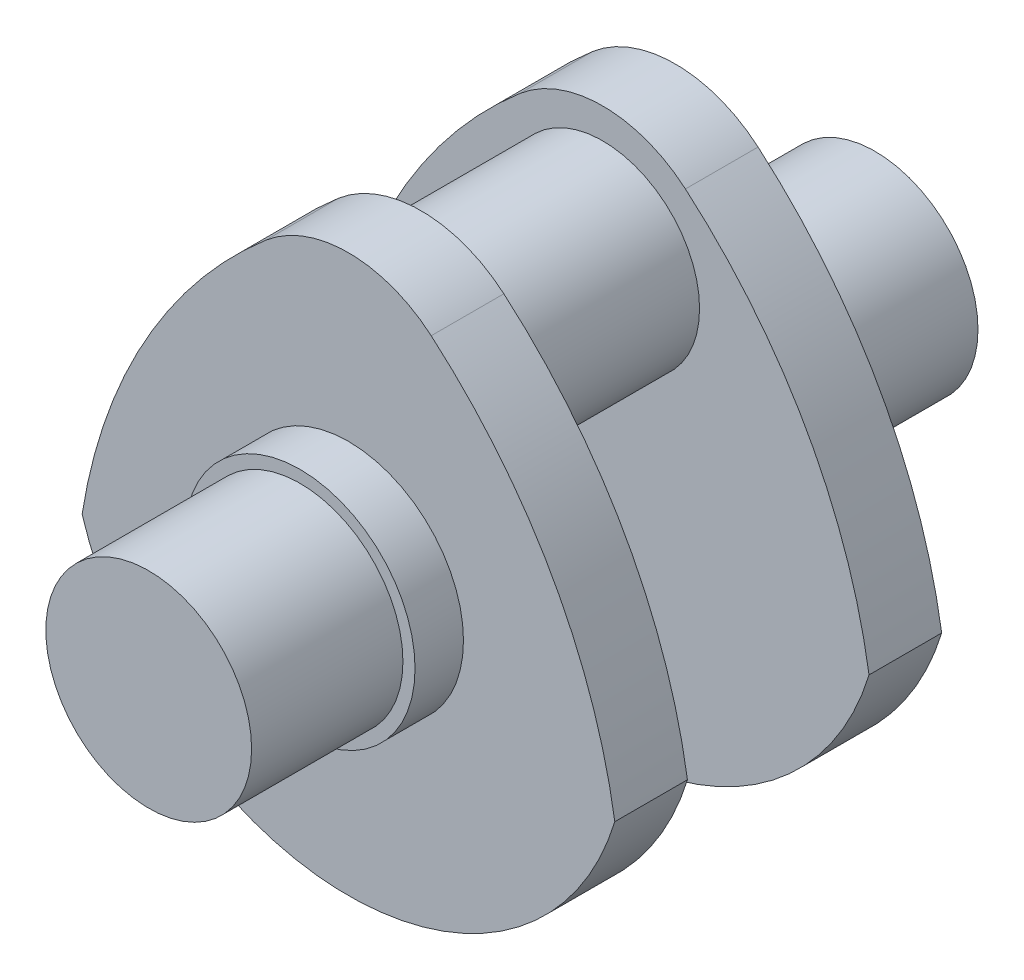
ISO-10303-21;
HEADER;
FILE_DESCRIPTION(('STEP AP214'),'2;1');
FILE_NAME('part.step','',(''),(''),'','','');
FILE_SCHEMA(('AUTOMOTIVE_DESIGN { 1 0 10303 214 1 1 1 1 }'));
ENDSEC;
DATA;
#1=APPLICATION_CONTEXT('core data for automotive mechanical design processes');
#2=APPLICATION_PROTOCOL_DEFINITION('international standard','automotive_design',2000,#1);
#3=PRODUCT_CONTEXT('',#1,'mechanical');
#4=PRODUCT('Part','Part','',(#3));
#5=PRODUCT_RELATED_PRODUCT_CATEGORY('part','',(#4));
#6=PRODUCT_DEFINITION_FORMATION('','',#4);
#7=PRODUCT_DEFINITION_CONTEXT('part definition',#1,'design');
#8=PRODUCT_DEFINITION('design','',#6,#7);
#9=PRODUCT_DEFINITION_SHAPE('','',#8);
#10=(LENGTH_UNIT() NAMED_UNIT(*) SI_UNIT(.MILLI.,.METRE.));
#11=(NAMED_UNIT(*) PLANE_ANGLE_UNIT() SI_UNIT($,.RADIAN.));
#12=(NAMED_UNIT(*) SI_UNIT($,.STERADIAN.) SOLID_ANGLE_UNIT());
#13=UNCERTAINTY_MEASURE_WITH_UNIT(LENGTH_MEASURE(1.E-05),#10,'distance_accuracy_value','');
#14=(GEOMETRIC_REPRESENTATION_CONTEXT(3) GLOBAL_UNCERTAINTY_ASSIGNED_CONTEXT((#13)) GLOBAL_UNIT_ASSIGNED_CONTEXT((#10,
#11,#12)) REPRESENTATION_CONTEXT('',''));
#15=CARTESIAN_POINT('',(0.,0.,0.));
#16=DIRECTION('',(0.,0.,1.));
#17=DIRECTION('',(1.,0.,0.));
#18=AXIS2_PLACEMENT_3D('',#15,#16,#17);
#19=CARTESIAN_POINT('',(0.,0.,25.));
#20=DIRECTION('',(0.,0.,-1.));
#21=DIRECTION('',(-1.,0.,0.));
#22=AXIS2_PLACEMENT_3D('',#19,#20,#21);
#23=CYLINDRICAL_SURFACE('',#22,17.);
#24=CARTESIAN_POINT('',(0.,0.,25.));
#25=DIRECTION('',(0.,0.,1.));
#26=DIRECTION('',(1.,0.,0.));
#27=AXIS2_PLACEMENT_3D('',#24,#25,#26);
#28=CIRCLE('',#27,17.);
#29=CARTESIAN_POINT('',(17.,0.,25.));
#30=VERTEX_POINT('',#29);
#31=EDGE_CURVE('E41',#30,#30,#28,.T.);
#32=ORIENTED_EDGE('',*,*,#31,.F.);
#33=EDGE_LOOP('',(#32));
#34=FACE_BOUND('',#33,.T.);
#35=CARTESIAN_POINT('',(0.,0.,0.));
#36=DIRECTION('',(0.,0.,1.));
#37=DIRECTION('',(1.,0.,0.));
#38=AXIS2_PLACEMENT_3D('',#35,#36,#37);
#39=CIRCLE('',#38,17.);
#40=CARTESIAN_POINT('',(17.,0.,0.));
#41=VERTEX_POINT('',#40);
#42=EDGE_CURVE('E193',#41,#41,#39,.T.);
#43=ORIENTED_EDGE('',*,*,#42,.T.);
#44=EDGE_LOOP('',(#43));
#45=FACE_BOUND('',#44,.T.);
#46=ADVANCED_FACE('F33',(#34,#45),#23,.T.);
#47=CARTESIAN_POINT('',(0.,0.,25.));
#48=DIRECTION('',(0.,0.,1.));
#49=DIRECTION('',(1.,0.,0.));
#50=AXIS2_PLACEMENT_3D('',#47,#48,#49);
#51=PLANE('',#50);
#52=ORIENTED_EDGE('',*,*,#31,.T.);
#53=EDGE_LOOP('',(#52));
#54=FACE_BOUND('',#53,.T.);
#55=ADVANCED_FACE('F208',(#54),#51,.T.);
#56=CARTESIAN_POINT('',(0.,0.,-8.));
#57=DIRECTION('',(0.,0.,1.));
#58=DIRECTION('',(1.,0.,0.));
#59=AXIS2_PLACEMENT_3D('',#56,#57,#58);
#60=CYLINDRICAL_SURFACE('',#59,19.);
#61=CARTESIAN_POINT('',(0.,0.,-8.));
#62=DIRECTION('',(0.,0.,1.));
#63=DIRECTION('',(1.,0.,0.));
#64=AXIS2_PLACEMENT_3D('',#61,#62,#63);
#65=CIRCLE('',#64,19.);
#66=CARTESIAN_POINT('',(19.,0.,-8.));
#67=VERTEX_POINT('',#66);
#68=EDGE_CURVE('E187',#67,#67,#65,.T.);
#69=ORIENTED_EDGE('',*,*,#68,.T.);
#70=EDGE_LOOP('',(#69));
#71=FACE_BOUND('',#70,.T.);
#72=CARTESIAN_POINT('',(0.,0.,0.));
#73=DIRECTION('',(0.,0.,1.));
#74=DIRECTION('',(1.,0.,0.));
#75=AXIS2_PLACEMENT_3D('',#72,#73,#74);
#76=CIRCLE('',#75,19.);
#77=CARTESIAN_POINT('',(19.,0.,0.));
#78=VERTEX_POINT('',#77);
#79=EDGE_CURVE('E190',#78,#78,#76,.T.);
#80=ORIENTED_EDGE('',*,*,#79,.F.);
#81=EDGE_LOOP('',(#80));
#82=FACE_BOUND('',#81,.T.);
#83=ADVANCED_FACE('F203',(#71,#82),#60,.T.);
#84=CARTESIAN_POINT('',(0.,0.,0.));
#85=DIRECTION('',(0.,0.,1.));
#86=DIRECTION('',(1.,0.,0.));
#87=AXIS2_PLACEMENT_3D('',#84,#85,#86);
#88=PLANE('',#87);
#89=ORIENTED_EDGE('',*,*,#42,.F.);
#90=EDGE_LOOP('',(#89));
#91=FACE_BOUND('',#90,.T.);
#92=ORIENTED_EDGE('',*,*,#79,.T.);
#93=EDGE_LOOP('',(#92));
#94=FACE_BOUND('',#93,.T.);
#95=ADVANCED_FACE('F199',(#91,#94),#88,.T.);
#96=CARTESIAN_POINT('',(44.9094542035734,-27.3845485151599,-20.));
#97=DIRECTION('',(0.,0.,1.));
#98=DIRECTION('',(1.,0.,0.));
#99=AXIS2_PLACEMENT_3D('',#96,#97,#98);
#100=CYLINDRICAL_SURFACE('',#99,90.);
#101=CARTESIAN_POINT('',(44.9094542035734,-27.3845485151599,-8.));
#102=DIRECTION('',(0.,0.,-1.));
#103=DIRECTION('',(1.,0.,0.));
#104=AXIS2_PLACEMENT_3D('',#101,#102,#103);
#105=CIRCLE('',#104,90.);
#106=CARTESIAN_POINT('',(-44.,-13.4164078649987,-8.));
#107=VERTEX_POINT('',#106);
#108=CARTESIAN_POINT('',(-13.6680947576093,40.9431234611356,-8.));
#109=VERTEX_POINT('',#108);
#110=EDGE_CURVE('E166',#107,#109,#105,.T.);
#111=ORIENTED_EDGE('',*,*,#110,.T.);
#112=DIRECTION('',(0.,0.,1.));
#113=VECTOR('',#112,1.);
#114=CARTESIAN_POINT('',(-13.6680947576093,40.9431234611356,-20.));
#115=LINE('',#114,#113);
#116=CARTESIAN_POINT('',(-13.6680947576093,40.9431234611356,-20.));
#117=VERTEX_POINT('',#116);
#118=EDGE_CURVE('E185',#117,#109,#115,.T.);
#119=ORIENTED_EDGE('',*,*,#118,.F.);
#120=CARTESIAN_POINT('',(44.9094542035734,-27.3845485151599,-20.));
#121=DIRECTION('',(0.,0.,-1.));
#122=DIRECTION('',(1.,0.,0.));
#123=AXIS2_PLACEMENT_3D('',#120,#121,#122);
#124=CIRCLE('',#123,90.);
#125=CARTESIAN_POINT('',(-44.,-13.4164078649987,-20.));
#126=VERTEX_POINT('',#125);
#127=EDGE_CURVE('E167',#126,#117,#124,.T.);
#128=ORIENTED_EDGE('',*,*,#127,.F.);
#129=DIRECTION('',(0.,0.,1.));
#130=VECTOR('',#129,1.);
#131=CARTESIAN_POINT('',(-44.,-13.4164078649987,-20.));
#132=LINE('',#131,#130);
#133=EDGE_CURVE('E173',#126,#107,#132,.T.);
#134=ORIENTED_EDGE('',*,*,#133,.T.);
#135=EDGE_LOOP('',(#111,#119,#128,#134));
#136=FACE_BOUND('',#135,.T.);
#137=ADVANCED_FACE('F202',(#136),#100,.T.);
#138=CARTESIAN_POINT('',(0.,25.,-20.));
#139=DIRECTION('',(0.,0.,1.));
#140=DIRECTION('',(1.,0.,0.));
#141=AXIS2_PLACEMENT_3D('',#138,#139,#140);
#142=CYLINDRICAL_SURFACE('',#141,21.);
#143=CARTESIAN_POINT('',(0.,25.,-8.));
#144=DIRECTION('',(0.,0.,-1.));
#145=DIRECTION('',(-1.,0.,0.));
#146=AXIS2_PLACEMENT_3D('',#143,#144,#145);
#147=CIRCLE('',#146,21.);
#148=CARTESIAN_POINT('',(13.6680947576093,40.9431234611356,-8.));
#149=VERTEX_POINT('',#148);
#150=EDGE_CURVE('E176',#109,#149,#147,.T.);
#151=ORIENTED_EDGE('',*,*,#150,.T.);
#152=DIRECTION('',(0.,0.,1.));
#153=VECTOR('',#152,1.);
#154=CARTESIAN_POINT('',(13.6680947576093,40.9431234611356,-20.));
#155=LINE('',#154,#153);
#156=CARTESIAN_POINT('',(13.6680947576093,40.9431234611356,-20.));
#157=VERTEX_POINT('',#156);
#158=EDGE_CURVE('E183',#157,#149,#155,.T.);
#159=ORIENTED_EDGE('',*,*,#158,.F.);
#160=CARTESIAN_POINT('',(0.,25.,-20.));
#161=DIRECTION('',(0.,0.,-1.));
#162=DIRECTION('',(-1.,0.,0.));
#163=AXIS2_PLACEMENT_3D('',#160,#161,#162);
#164=CIRCLE('',#163,21.);
#165=EDGE_CURVE('E81',#117,#157,#164,.T.);
#166=ORIENTED_EDGE('',*,*,#165,.F.);
#167=ORIENTED_EDGE('',*,*,#118,.T.);
#168=EDGE_LOOP('',(#151,#159,#166,#167));
#169=FACE_BOUND('',#168,.T.);
#170=ADVANCED_FACE('F243',(#169),#142,.T.);
#171=CARTESIAN_POINT('',(-44.9094542035734,-27.3845485151599,-20.));
#172=DIRECTION('',(0.,0.,1.));
#173=DIRECTION('',(1.,0.,0.));
#174=AXIS2_PLACEMENT_3D('',#171,#172,#173);
#175=CYLINDRICAL_SURFACE('',#174,90.);
#176=CARTESIAN_POINT('',(-44.9094542035734,-27.3845485151599,-8.));
#177=DIRECTION('',(0.,0.,-1.));
#178=DIRECTION('',(-1.,0.,0.));
#179=AXIS2_PLACEMENT_3D('',#176,#177,#178);
#180=CIRCLE('',#179,90.);
#181=CARTESIAN_POINT('',(44.,-13.4164078649987,-8.));
#182=VERTEX_POINT('',#181);
#183=EDGE_CURVE('E67',#149,#182,#180,.T.);
#184=ORIENTED_EDGE('',*,*,#183,.T.);
#185=DIRECTION('',(0.,0.,1.));
#186=VECTOR('',#185,1.);
#187=CARTESIAN_POINT('',(44.,-13.4164078649987,-20.));
#188=LINE('',#187,#186);
#189=CARTESIAN_POINT('',(44.,-13.4164078649987,-20.));
#190=VERTEX_POINT('',#189);
#191=EDGE_CURVE('E181',#190,#182,#188,.T.);
#192=ORIENTED_EDGE('',*,*,#191,.F.);
#193=CARTESIAN_POINT('',(-44.9094542035734,-27.3845485151599,-20.));
#194=DIRECTION('',(0.,0.,-1.));
#195=DIRECTION('',(-1.,0.,0.));
#196=AXIS2_PLACEMENT_3D('',#193,#194,#195);
#197=CIRCLE('',#196,90.);
#198=EDGE_CURVE('E170',#157,#190,#197,.T.);
#199=ORIENTED_EDGE('',*,*,#198,.F.);
#200=ORIENTED_EDGE('',*,*,#158,.T.);
#201=EDGE_LOOP('',(#184,#192,#199,#200));
#202=FACE_BOUND('',#201,.T.);
#203=ADVANCED_FACE('F252',(#202),#175,.T.);
#204=CARTESIAN_POINT('',(0.,0.,-20.));
#205=DIRECTION('',(0.,0.,1.));
#206=DIRECTION('',(1.,0.,0.));
#207=AXIS2_PLACEMENT_3D('',#204,#205,#206);
#208=CYLINDRICAL_SURFACE('',#207,46.);
#209=CARTESIAN_POINT('',(0.,0.,-8.));
#210=DIRECTION('',(0.,0.,-1.));
#211=DIRECTION('',(1.,0.,0.));
#212=AXIS2_PLACEMENT_3D('',#209,#210,#211);
#213=CIRCLE('',#212,46.);
#214=EDGE_CURVE('E73',#182,#107,#213,.T.);
#215=ORIENTED_EDGE('',*,*,#214,.T.);
#216=ORIENTED_EDGE('',*,*,#133,.F.);
#217=CARTESIAN_POINT('',(0.,0.,-20.));
#218=DIRECTION('',(0.,0.,-1.));
#219=DIRECTION('',(1.,0.,0.));
#220=AXIS2_PLACEMENT_3D('',#217,#218,#219);
#221=CIRCLE('',#220,46.);
#222=EDGE_CURVE('E49',#190,#126,#221,.T.);
#223=ORIENTED_EDGE('',*,*,#222,.F.);
#224=ORIENTED_EDGE('',*,*,#191,.T.);
#225=EDGE_LOOP('',(#215,#216,#223,#224));
#226=FACE_BOUND('',#225,.T.);
#227=ADVANCED_FACE('F260',(#226),#208,.T.);
#228=CARTESIAN_POINT('',(22.4547271017867,-13.69227425758,-20.));
#229=DIRECTION('',(0.,0.,1.));
#230=DIRECTION('',(1.,0.,0.));
#231=AXIS2_PLACEMENT_3D('',#228,#229,#230);
#232=PLANE('',#231);
#233=CARTESIAN_POINT('',(0.,25.,-20.));
#234=DIRECTION('',(0.,0.,1.));
#235=DIRECTION('',(1.,0.,0.));
#236=AXIS2_PLACEMENT_3D('',#233,#234,#235);
#237=CIRCLE('',#236,16.);
#238=CARTESIAN_POINT('',(16.,25.,-20.));
#239=VERTEX_POINT('',#238);
#240=EDGE_CURVE('E11',#239,#239,#237,.F.);
#241=ORIENTED_EDGE('',*,*,#240,.F.);
#242=EDGE_LOOP('',(#241));
#243=FACE_BOUND('',#242,.T.);
#244=ORIENTED_EDGE('',*,*,#127,.T.);
#245=ORIENTED_EDGE('',*,*,#165,.T.);
#246=ORIENTED_EDGE('',*,*,#198,.T.);
#247=ORIENTED_EDGE('',*,*,#222,.T.);
#248=EDGE_LOOP('',(#244,#245,#246,#247));
#249=FACE_BOUND('',#248,.T.);
#250=ADVANCED_FACE('F268',(#243,#249),#232,.F.);
#251=CARTESIAN_POINT('',(22.4547271017867,-13.69227425758,-8.));
#252=DIRECTION('',(0.,0.,1.));
#253=DIRECTION('',(1.,0.,0.));
#254=AXIS2_PLACEMENT_3D('',#251,#252,#253);
#255=PLANE('',#254);
#256=ORIENTED_EDGE('',*,*,#68,.F.);
#257=EDGE_LOOP('',(#256));
#258=FACE_BOUND('',#257,.T.);
#259=ORIENTED_EDGE('',*,*,#110,.F.);
#260=ORIENTED_EDGE('',*,*,#214,.F.);
#261=ORIENTED_EDGE('',*,*,#183,.F.);
#262=ORIENTED_EDGE('',*,*,#150,.F.);
#263=EDGE_LOOP('',(#259,#260,#261,#262));
#264=FACE_BOUND('',#263,.T.);
#265=ADVANCED_FACE('F277',(#258,#264),#255,.T.);
#266=CARTESIAN_POINT('',(0.,25.,-35.));
#267=DIRECTION('',(0.,0.,1.));
#268=DIRECTION('',(1.,0.,0.));
#269=AXIS2_PLACEMENT_3D('',#266,#267,#268);
#270=CYLINDRICAL_SURFACE('',#269,16.);
#271=ORIENTED_EDGE('',*,*,#240,.T.);
#272=EDGE_LOOP('',(#271));
#273=FACE_BOUND('',#272,.T.);
#274=CARTESIAN_POINT('',(0.,25.,-50.));
#275=DIRECTION('',(0.,0.,1.));
#276=DIRECTION('',(1.,0.,0.));
#277=AXIS2_PLACEMENT_3D('',#274,#275,#276);
#278=CIRCLE('',#277,16.);
#279=CARTESIAN_POINT('',(16.,25.,-50.));
#280=VERTEX_POINT('',#279);
#281=EDGE_CURVE('E161',#280,#280,#278,.F.);
#282=ORIENTED_EDGE('',*,*,#281,.F.);
#283=EDGE_LOOP('',(#282));
#284=FACE_BOUND('',#283,.T.);
#285=ADVANCED_FACE('F286',(#273,#284),#270,.T.);
#286=CARTESIAN_POINT('',(0.,0.,-95.));
#287=DIRECTION('',(0.,0.,1.));
#288=DIRECTION('',(-1.,0.,0.));
#289=AXIS2_PLACEMENT_3D('',#286,#287,#288);
#290=CYLINDRICAL_SURFACE('',#289,17.);
#291=CARTESIAN_POINT('',(0.,0.,-95.));
#292=DIRECTION('',(0.,0.,1.));
#293=DIRECTION('',(1.,0.,0.));
#294=AXIS2_PLACEMENT_3D('',#291,#292,#293);
#295=CIRCLE('',#294,17.);
#296=CARTESIAN_POINT('',(17.,0.,-95.));
#297=VERTEX_POINT('',#296);
#298=EDGE_CURVE('E158',#297,#297,#295,.T.);
#299=ORIENTED_EDGE('',*,*,#298,.T.);
#300=EDGE_LOOP('',(#299));
#301=FACE_BOUND('',#300,.T.);
#302=CARTESIAN_POINT('',(0.,0.,-70.));
#303=DIRECTION('',(0.,0.,1.));
#304=DIRECTION('',(1.,0.,0.));
#305=AXIS2_PLACEMENT_3D('',#302,#303,#304);
#306=CIRCLE('',#305,17.);
#307=CARTESIAN_POINT('',(17.,0.,-70.));
#308=VERTEX_POINT('',#307);
#309=EDGE_CURVE('E157',#308,#308,#306,.T.);
#310=ORIENTED_EDGE('',*,*,#309,.F.);
#311=EDGE_LOOP('',(#310));
#312=FACE_BOUND('',#311,.T.);
#313=ADVANCED_FACE('F295',(#301,#312),#290,.T.);
#314=CARTESIAN_POINT('',(0.,0.,-95.));
#315=DIRECTION('',(0.,0.,-1.));
#316=DIRECTION('',(1.,0.,0.));
#317=AXIS2_PLACEMENT_3D('',#314,#315,#316);
#318=PLANE('',#317);
#319=ORIENTED_EDGE('',*,*,#298,.F.);
#320=EDGE_LOOP('',(#319));
#321=FACE_BOUND('',#320,.T.);
#322=ADVANCED_FACE('F303',(#321),#318,.T.);
#323=CARTESIAN_POINT('',(0.,0.,-62.));
#324=DIRECTION('',(0.,0.,-1.));
#325=DIRECTION('',(1.,0.,0.));
#326=AXIS2_PLACEMENT_3D('',#323,#324,#325);
#327=CYLINDRICAL_SURFACE('',#326,19.);
#328=CARTESIAN_POINT('',(0.,0.,-62.));
#329=DIRECTION('',(0.,0.,1.));
#330=DIRECTION('',(1.,0.,0.));
#331=AXIS2_PLACEMENT_3D('',#328,#329,#330);
#332=CIRCLE('',#331,19.);
#333=CARTESIAN_POINT('',(19.,0.,-62.));
#334=VERTEX_POINT('',#333);
#335=EDGE_CURVE('E128',#334,#334,#332,.T.);
#336=ORIENTED_EDGE('',*,*,#335,.F.);
#337=EDGE_LOOP('',(#336));
#338=FACE_BOUND('',#337,.T.);
#339=CARTESIAN_POINT('',(0.,0.,-70.));
#340=DIRECTION('',(0.,0.,1.));
#341=DIRECTION('',(1.,0.,0.));
#342=AXIS2_PLACEMENT_3D('',#339,#340,#341);
#343=CIRCLE('',#342,19.);
#344=CARTESIAN_POINT('',(19.,0.,-70.));
#345=VERTEX_POINT('',#344);
#346=EDGE_CURVE('E154',#345,#345,#343,.T.);
#347=ORIENTED_EDGE('',*,*,#346,.T.);
#348=EDGE_LOOP('',(#347));
#349=FACE_BOUND('',#348,.T.);
#350=ADVANCED_FACE('F311',(#338,#349),#327,.T.);
#351=CARTESIAN_POINT('',(0.,0.,-70.));
#352=DIRECTION('',(0.,0.,-1.));
#353=DIRECTION('',(1.,0.,0.));
#354=AXIS2_PLACEMENT_3D('',#351,#352,#353);
#355=PLANE('',#354);
#356=ORIENTED_EDGE('',*,*,#309,.T.);
#357=EDGE_LOOP('',(#356));
#358=FACE_BOUND('',#357,.T.);
#359=ORIENTED_EDGE('',*,*,#346,.F.);
#360=EDGE_LOOP('',(#359));
#361=FACE_BOUND('',#360,.T.);
#362=ADVANCED_FACE('F319',(#358,#361),#355,.T.);
#363=CARTESIAN_POINT('',(44.9094542035734,-27.3845485151599,-50.));
#364=DIRECTION('',(0.,0.,-1.));
#365=DIRECTION('',(1.,0.,0.));
#366=AXIS2_PLACEMENT_3D('',#363,#364,#365);
#367=CYLINDRICAL_SURFACE('',#366,90.);
#368=CARTESIAN_POINT('',(44.9094542035734,-27.3845485151599,-62.));
#369=DIRECTION('',(0.,0.,-1.));
#370=DIRECTION('',(1.,0.,0.));
#371=AXIS2_PLACEMENT_3D('',#368,#369,#370);
#372=CIRCLE('',#371,90.);
#373=CARTESIAN_POINT('',(-44.,-13.4164078649987,-62.));
#374=VERTEX_POINT('',#373);
#375=CARTESIAN_POINT('',(-13.6680947576093,40.9431234611356,-62.));
#376=VERTEX_POINT('',#375);
#377=EDGE_CURVE('E142',#374,#376,#372,.T.);
#378=ORIENTED_EDGE('',*,*,#377,.F.);
#379=DIRECTION('',(0.,0.,-1.));
#380=VECTOR('',#379,1.);
#381=CARTESIAN_POINT('',(-44.,-13.4164078649987,-50.));
#382=LINE('',#381,#380);
#383=CARTESIAN_POINT('',(-44.,-13.4164078649987,-50.));
#384=VERTEX_POINT('',#383);
#385=EDGE_CURVE('E133',#384,#374,#382,.T.);
#386=ORIENTED_EDGE('',*,*,#385,.F.);
#387=CARTESIAN_POINT('',(44.9094542035734,-27.3845485151599,-50.));
#388=DIRECTION('',(0.,0.,-1.));
#389=DIRECTION('',(1.,0.,0.));
#390=AXIS2_PLACEMENT_3D('',#387,#388,#389);
#391=CIRCLE('',#390,90.);
#392=CARTESIAN_POINT('',(-13.6680947576093,40.9431234611356,-50.));
#393=VERTEX_POINT('',#392);
#394=EDGE_CURVE('E112',#384,#393,#391,.T.);
#395=ORIENTED_EDGE('',*,*,#394,.T.);
#396=DIRECTION('',(0.,0.,-1.));
#397=VECTOR('',#396,1.);
#398=CARTESIAN_POINT('',(-13.6680947576093,40.9431234611356,-50.));
#399=LINE('',#398,#397);
#400=EDGE_CURVE('E121',#393,#376,#399,.T.);
#401=ORIENTED_EDGE('',*,*,#400,.T.);
#402=EDGE_LOOP('',(#378,#386,#395,#401));
#403=FACE_BOUND('',#402,.T.);
#404=ADVANCED_FACE('F131',(#403),#367,.T.);
#405=CARTESIAN_POINT('',(0.,25.,-50.));
#406=DIRECTION('',(0.,0.,-1.));
#407=DIRECTION('',(1.,0.,0.));
#408=AXIS2_PLACEMENT_3D('',#405,#406,#407);
#409=CYLINDRICAL_SURFACE('',#408,21.);
#410=CARTESIAN_POINT('',(0.,25.,-62.));
#411=DIRECTION('',(0.,0.,-1.));
#412=DIRECTION('',(-1.,0.,0.));
#413=AXIS2_PLACEMENT_3D('',#410,#411,#412);
#414=CIRCLE('',#413,21.);
#415=CARTESIAN_POINT('',(13.6680947576093,40.9431234611356,-62.));
#416=VERTEX_POINT('',#415);
#417=EDGE_CURVE('E124',#376,#416,#414,.T.);
#418=ORIENTED_EDGE('',*,*,#417,.F.);
#419=ORIENTED_EDGE('',*,*,#400,.F.);
#420=CARTESIAN_POINT('',(0.,25.,-50.));
#421=DIRECTION('',(0.,0.,-1.));
#422=DIRECTION('',(-1.,0.,0.));
#423=AXIS2_PLACEMENT_3D('',#420,#421,#422);
#424=CIRCLE('',#423,21.);
#425=CARTESIAN_POINT('',(13.6680947576093,40.9431234611356,-50.));
#426=VERTEX_POINT('',#425);
#427=EDGE_CURVE('E108',#393,#426,#424,.T.);
#428=ORIENTED_EDGE('',*,*,#427,.T.);
#429=DIRECTION('',(0.,0.,-1.));
#430=VECTOR('',#429,1.);
#431=CARTESIAN_POINT('',(13.6680947576093,40.9431234611356,-50.));
#432=LINE('',#431,#430);
#433=EDGE_CURVE('E129',#426,#416,#432,.T.);
#434=ORIENTED_EDGE('',*,*,#433,.T.);
#435=EDGE_LOOP('',(#418,#419,#428,#434));
#436=FACE_BOUND('',#435,.T.);
#437=ADVANCED_FACE('F122',(#436),#409,.T.);
#438=CARTESIAN_POINT('',(-44.9094542035734,-27.3845485151599,-50.));
#439=DIRECTION('',(0.,0.,-1.));
#440=DIRECTION('',(1.,0.,0.));
#441=AXIS2_PLACEMENT_3D('',#438,#439,#440);
#442=CYLINDRICAL_SURFACE('',#441,90.);
#443=CARTESIAN_POINT('',(-44.9094542035734,-27.3845485151599,-62.));
#444=DIRECTION('',(0.,0.,-1.));
#445=DIRECTION('',(-1.,0.,0.));
#446=AXIS2_PLACEMENT_3D('',#443,#444,#445);
#447=CIRCLE('',#446,90.);
#448=CARTESIAN_POINT('',(44.,-13.4164078649987,-62.));
#449=VERTEX_POINT('',#448);
#450=EDGE_CURVE('E136',#416,#449,#447,.T.);
#451=ORIENTED_EDGE('',*,*,#450,.F.);
#452=ORIENTED_EDGE('',*,*,#433,.F.);
#453=CARTESIAN_POINT('',(-44.9094542035734,-27.3845485151599,-50.));
#454=DIRECTION('',(0.,0.,-1.));
#455=DIRECTION('',(-1.,0.,0.));
#456=AXIS2_PLACEMENT_3D('',#453,#454,#455);
#457=CIRCLE('',#456,90.);
#458=CARTESIAN_POINT('',(44.,-13.4164078649987,-50.));
#459=VERTEX_POINT('',#458);
#460=EDGE_CURVE('E115',#426,#459,#457,.T.);
#461=ORIENTED_EDGE('',*,*,#460,.T.);
#462=DIRECTION('',(0.,0.,-1.));
#463=VECTOR('',#462,1.);
#464=CARTESIAN_POINT('',(44.,-13.4164078649987,-50.));
#465=LINE('',#464,#463);
#466=EDGE_CURVE('E148',#459,#449,#465,.T.);
#467=ORIENTED_EDGE('',*,*,#466,.T.);
#468=EDGE_LOOP('',(#451,#452,#461,#467));
#469=FACE_BOUND('',#468,.T.);
#470=ADVANCED_FACE('F340',(#469),#442,.T.);
#471=CARTESIAN_POINT('',(0.,0.,-50.));
#472=DIRECTION('',(0.,0.,-1.));
#473=DIRECTION('',(1.,0.,0.));
#474=AXIS2_PLACEMENT_3D('',#471,#472,#473);
#475=CYLINDRICAL_SURFACE('',#474,46.);
#476=CARTESIAN_POINT('',(0.,0.,-62.));
#477=DIRECTION('',(0.,0.,-1.));
#478=DIRECTION('',(1.,0.,0.));
#479=AXIS2_PLACEMENT_3D('',#476,#477,#478);
#480=CIRCLE('',#479,46.);
#481=EDGE_CURVE('E134',#449,#374,#480,.T.);
#482=ORIENTED_EDGE('',*,*,#481,.F.);
#483=ORIENTED_EDGE('',*,*,#466,.F.);
#484=CARTESIAN_POINT('',(0.,0.,-50.));
#485=DIRECTION('',(0.,0.,-1.));
#486=DIRECTION('',(1.,0.,0.));
#487=AXIS2_PLACEMENT_3D('',#484,#485,#486);
#488=CIRCLE('',#487,46.);
#489=EDGE_CURVE('E140',#459,#384,#488,.T.);
#490=ORIENTED_EDGE('',*,*,#489,.T.);
#491=ORIENTED_EDGE('',*,*,#385,.T.);
#492=EDGE_LOOP('',(#482,#483,#490,#491));
#493=FACE_BOUND('',#492,.T.);
#494=ADVANCED_FACE('F347',(#493),#475,.T.);
#495=CARTESIAN_POINT('',(22.4547271017867,-13.69227425758,-50.));
#496=DIRECTION('',(0.,0.,-1.));
#497=DIRECTION('',(1.,0.,0.));
#498=AXIS2_PLACEMENT_3D('',#495,#496,#497);
#499=PLANE('',#498);
#500=ORIENTED_EDGE('',*,*,#281,.T.);
#501=EDGE_LOOP('',(#500));
#502=FACE_BOUND('',#501,.T.);
#503=ORIENTED_EDGE('',*,*,#394,.F.);
#504=ORIENTED_EDGE('',*,*,#489,.F.);
#505=ORIENTED_EDGE('',*,*,#460,.F.);
#506=ORIENTED_EDGE('',*,*,#427,.F.);
#507=EDGE_LOOP('',(#503,#504,#505,#506));
#508=FACE_BOUND('',#507,.T.);
#509=ADVANCED_FACE('F110',(#502,#508),#499,.F.);
#510=CARTESIAN_POINT('',(22.4547271017867,-13.69227425758,-62.));
#511=DIRECTION('',(0.,0.,-1.));
#512=DIRECTION('',(1.,0.,0.));
#513=AXIS2_PLACEMENT_3D('',#510,#511,#512);
#514=PLANE('',#513);
#515=ORIENTED_EDGE('',*,*,#335,.T.);
#516=EDGE_LOOP('',(#515));
#517=FACE_BOUND('',#516,.T.);
#518=ORIENTED_EDGE('',*,*,#377,.T.);
#519=ORIENTED_EDGE('',*,*,#417,.T.);
#520=ORIENTED_EDGE('',*,*,#450,.T.);
#521=ORIENTED_EDGE('',*,*,#481,.T.);
#522=EDGE_LOOP('',(#518,#519,#520,#521));
#523=FACE_BOUND('',#522,.T.);
#524=ADVANCED_FACE('F362',(#517,#523),#514,.T.);
#525=CLOSED_SHELL('',(#46,#55,#83,#95,#137,#170,#203,#227,#250,#265,#285,#313,#322,#350,#362,
#404,#437,#470,#494,#509,#524));
#526=MANIFOLD_SOLID_BREP('B2',#525);
#527=ADVANCED_BREP_SHAPE_REPRESENTATION('',(#18,#526),#14);
#528=SHAPE_DEFINITION_REPRESENTATION(#9,#527);
ENDSEC;
END-ISO-10303-21;
